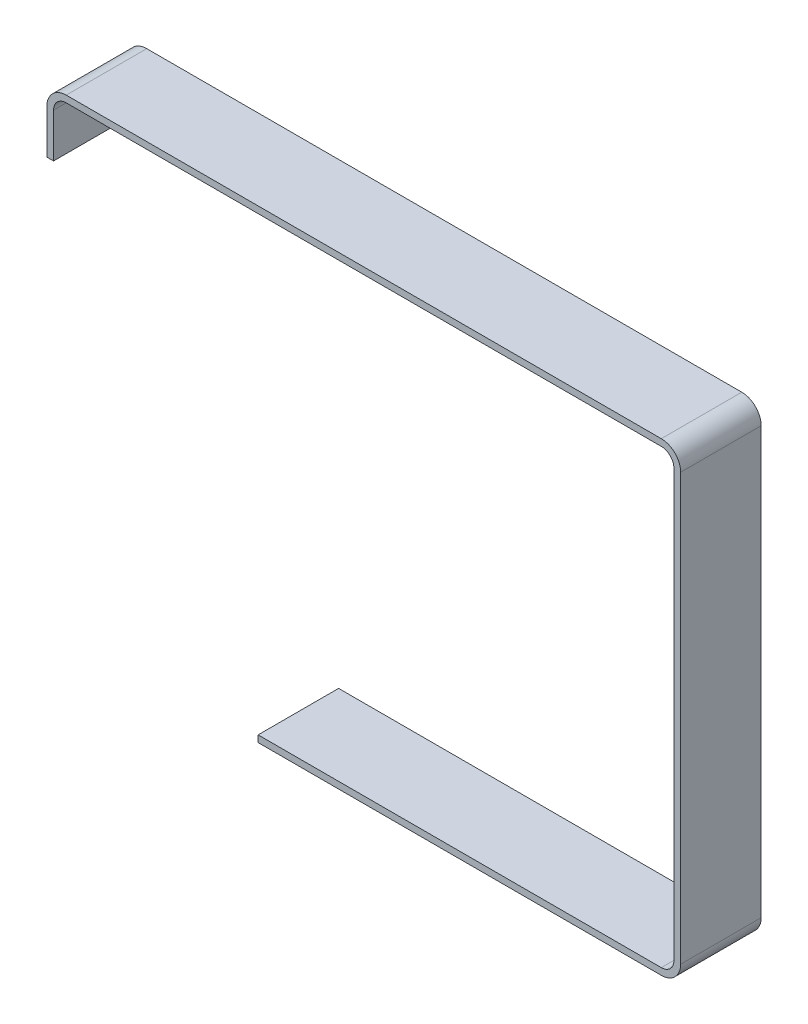
ISO-10303-21;
HEADER;
FILE_DESCRIPTION(('STEP AP214'),'2;1');
FILE_NAME('part.step','',(''),(''),'','','');
FILE_SCHEMA(('AUTOMOTIVE_DESIGN { 1 0 10303 214 1 1 1 1 }'));
ENDSEC;
DATA;
#1=APPLICATION_CONTEXT('core data for automotive mechanical design processes');
#2=APPLICATION_PROTOCOL_DEFINITION('international standard','automotive_design',2000,#1);
#3=PRODUCT_CONTEXT('',#1,'mechanical');
#4=PRODUCT('Part','Part','',(#3));
#5=PRODUCT_RELATED_PRODUCT_CATEGORY('part','',(#4));
#6=PRODUCT_DEFINITION_FORMATION('','',#4);
#7=PRODUCT_DEFINITION_CONTEXT('part definition',#1,'design');
#8=PRODUCT_DEFINITION('design','',#6,#7);
#9=PRODUCT_DEFINITION_SHAPE('','',#8);
#10=(LENGTH_UNIT() NAMED_UNIT(*) SI_UNIT(.MILLI.,.METRE.));
#11=(NAMED_UNIT(*) PLANE_ANGLE_UNIT() SI_UNIT($,.RADIAN.));
#12=(NAMED_UNIT(*) SI_UNIT($,.STERADIAN.) SOLID_ANGLE_UNIT());
#13=UNCERTAINTY_MEASURE_WITH_UNIT(LENGTH_MEASURE(1.E-05),#10,'distance_accuracy_value','');
#14=(GEOMETRIC_REPRESENTATION_CONTEXT(3) GLOBAL_UNCERTAINTY_ASSIGNED_CONTEXT((#13)) GLOBAL_UNIT_ASSIGNED_CONTEXT((#10,
#11,#12)) REPRESENTATION_CONTEXT('',''));
#15=CARTESIAN_POINT('',(0.,0.,0.));
#16=DIRECTION('',(0.,0.,1.));
#17=DIRECTION('',(1.,0.,0.));
#18=AXIS2_PLACEMENT_3D('',#15,#16,#17);
#19=CARTESIAN_POINT('',(-100.,0.,19.05));
#20=DIRECTION('',(1.,0.,0.));
#21=DIRECTION('',(0.,0.,-1.));
#22=AXIS2_PLACEMENT_3D('',#19,#20,#21);
#23=PLANE('',#22);
#24=DIRECTION('',(0.,-1.,0.));
#25=VECTOR('',#24,1.);
#26=CARTESIAN_POINT('',(-100.,0.,0.));
#27=LINE('',#26,#25);
#28=CARTESIAN_POINT('',(-100.,1.5875,0.));
#29=VERTEX_POINT('',#28);
#30=CARTESIAN_POINT('',(-100.,0.,0.));
#31=VERTEX_POINT('',#30);
#32=EDGE_CURVE('E171',#29,#31,#27,.T.);
#33=ORIENTED_EDGE('',*,*,#32,.T.);
#34=DIRECTION('',(0.,0.,-1.));
#35=VECTOR('',#34,1.);
#36=CARTESIAN_POINT('',(-100.,0.,19.05));
#37=LINE('',#36,#35);
#38=CARTESIAN_POINT('',(-100.,0.,19.05));
#39=VERTEX_POINT('',#38);
#40=EDGE_CURVE('E153',#39,#31,#37,.T.);
#41=ORIENTED_EDGE('',*,*,#40,.F.);
#42=DIRECTION('',(0.,-1.,0.));
#43=VECTOR('',#42,1.);
#44=CARTESIAN_POINT('',(-100.,0.,19.05));
#45=LINE('',#44,#43);
#46=CARTESIAN_POINT('',(-100.,1.5875,19.05));
#47=VERTEX_POINT('',#46);
#48=EDGE_CURVE('E159',#47,#39,#45,.T.);
#49=ORIENTED_EDGE('',*,*,#48,.F.);
#50=DIRECTION('',(0.,0.,-1.));
#51=VECTOR('',#50,1.);
#52=CARTESIAN_POINT('',(-100.,1.5875,19.05));
#53=LINE('',#52,#51);
#54=EDGE_CURVE('E256',#47,#29,#53,.T.);
#55=ORIENTED_EDGE('',*,*,#54,.T.);
#56=EDGE_LOOP('',(#33,#41,#49,#55));
#57=FACE_BOUND('',#56,.T.);
#58=ADVANCED_FACE('F33',(#57),#23,.F.);
#59=CARTESIAN_POINT('',(-100.,0.,19.05));
#60=DIRECTION('',(0.,1.,0.));
#61=DIRECTION('',(0.,0.,1.));
#62=AXIS2_PLACEMENT_3D('',#59,#60,#61);
#63=PLANE('',#62);
#64=DIRECTION('',(1.,0.,0.));
#65=VECTOR('',#64,1.);
#66=CARTESIAN_POINT('',(-100.,0.,0.));
#67=LINE('',#66,#65);
#68=CARTESIAN_POINT('',(-4.58749999999999,0.,0.));
#69=VERTEX_POINT('',#68);
#70=EDGE_CURVE('E241',#31,#69,#67,.T.);
#71=ORIENTED_EDGE('',*,*,#70,.T.);
#72=DIRECTION('',(0.,0.,-1.));
#73=VECTOR('',#72,1.);
#74=CARTESIAN_POINT('',(-4.58749999999999,0.,19.05));
#75=LINE('',#74,#73);
#76=CARTESIAN_POINT('',(-4.58749999999999,0.,19.05));
#77=VERTEX_POINT('',#76);
#78=EDGE_CURVE('E156',#69,#77,#75,.F.);
#79=ORIENTED_EDGE('',*,*,#78,.T.);
#80=DIRECTION('',(1.,0.,0.));
#81=VECTOR('',#80,1.);
#82=CARTESIAN_POINT('',(-100.,0.,19.05));
#83=LINE('',#82,#81);
#84=EDGE_CURVE('E148',#39,#77,#83,.T.);
#85=ORIENTED_EDGE('',*,*,#84,.F.);
#86=ORIENTED_EDGE('',*,*,#40,.T.);
#87=EDGE_LOOP('',(#71,#79,#85,#86));
#88=FACE_BOUND('',#87,.T.);
#89=ADVANCED_FACE('F151',(#88),#63,.F.);
#90=CARTESIAN_POINT('',(0.,0.,19.05));
#91=DIRECTION('',(-1.,0.,0.));
#92=DIRECTION('',(0.,0.,1.));
#93=AXIS2_PLACEMENT_3D('',#90,#91,#92);
#94=PLANE('',#93);
#95=DIRECTION('',(0.,1.,0.));
#96=VECTOR('',#95,1.);
#97=CARTESIAN_POINT('',(0.,0.,19.05));
#98=LINE('',#97,#96);
#99=CARTESIAN_POINT('',(0.,4.5875,19.05));
#100=VERTEX_POINT('',#99);
#101=CARTESIAN_POINT('',(0.,105.4125,19.05));
#102=VERTEX_POINT('',#101);
#103=EDGE_CURVE('E158',#100,#102,#98,.T.);
#104=ORIENTED_EDGE('',*,*,#103,.F.);
#105=DIRECTION('',(0.,0.,-1.));
#106=VECTOR('',#105,1.);
#107=CARTESIAN_POINT('',(0.,4.5875,19.05));
#108=LINE('',#107,#106);
#109=CARTESIAN_POINT('',(0.,4.5875,0.));
#110=VERTEX_POINT('',#109);
#111=EDGE_CURVE('E208',#100,#110,#108,.T.);
#112=ORIENTED_EDGE('',*,*,#111,.T.);
#113=DIRECTION('',(0.,1.,0.));
#114=VECTOR('',#113,1.);
#115=CARTESIAN_POINT('',(0.,0.,0.));
#116=LINE('',#115,#114);
#117=CARTESIAN_POINT('',(0.,105.4125,0.));
#118=VERTEX_POINT('',#117);
#119=EDGE_CURVE('E237',#110,#118,#116,.T.);
#120=ORIENTED_EDGE('',*,*,#119,.T.);
#121=DIRECTION('',(0.,0.,-1.));
#122=VECTOR('',#121,1.);
#123=CARTESIAN_POINT('',(0.,105.4125,19.05));
#124=LINE('',#123,#122);
#125=EDGE_CURVE('E206',#118,#102,#124,.F.);
#126=ORIENTED_EDGE('',*,*,#125,.T.);
#127=EDGE_LOOP('',(#104,#112,#120,#126));
#128=FACE_BOUND('',#127,.T.);
#129=ADVANCED_FACE('F296',(#128),#94,.F.);
#130=CARTESIAN_POINT('',(0.,110.,19.05));
#131=DIRECTION('',(0.,-1.,0.));
#132=DIRECTION('',(0.,0.,-1.));
#133=AXIS2_PLACEMENT_3D('',#130,#131,#132);
#134=PLANE('',#133);
#135=DIRECTION('',(-1.,0.,0.));
#136=VECTOR('',#135,1.);
#137=CARTESIAN_POINT('',(0.,110.,19.05));
#138=LINE('',#137,#136);
#139=CARTESIAN_POINT('',(-4.5875,110.,19.05));
#140=VERTEX_POINT('',#139);
#141=CARTESIAN_POINT('',(-145.4125,110.,19.05));
#142=VERTEX_POINT('',#141);
#143=EDGE_CURVE('E228',#140,#142,#138,.T.);
#144=ORIENTED_EDGE('',*,*,#143,.F.);
#145=DIRECTION('',(0.,0.,-1.));
#146=VECTOR('',#145,1.);
#147=CARTESIAN_POINT('',(-4.5875,110.,19.05));
#148=LINE('',#147,#146);
#149=CARTESIAN_POINT('',(-4.5875,110.,0.));
#150=VERTEX_POINT('',#149);
#151=EDGE_CURVE('E41',#140,#150,#148,.T.);
#152=ORIENTED_EDGE('',*,*,#151,.T.);
#153=DIRECTION('',(-1.,0.,0.));
#154=VECTOR('',#153,1.);
#155=CARTESIAN_POINT('',(0.,110.,0.));
#156=LINE('',#155,#154);
#157=CARTESIAN_POINT('',(-145.4125,110.,0.));
#158=VERTEX_POINT('',#157);
#159=EDGE_CURVE('E227',#150,#158,#156,.T.);
#160=ORIENTED_EDGE('',*,*,#159,.T.);
#161=DIRECTION('',(0.,0.,-1.));
#162=VECTOR('',#161,1.);
#163=CARTESIAN_POINT('',(-145.4125,110.,19.05));
#164=LINE('',#163,#162);
#165=EDGE_CURVE('E56',#158,#142,#164,.F.);
#166=ORIENTED_EDGE('',*,*,#165,.T.);
#167=EDGE_LOOP('',(#144,#152,#160,#166));
#168=FACE_BOUND('',#167,.T.);
#169=ADVANCED_FACE('F226',(#168),#134,.F.);
#170=CARTESIAN_POINT('',(-150.,110.,19.05));
#171=DIRECTION('',(1.,0.,0.));
#172=DIRECTION('',(0.,1.,0.));
#173=AXIS2_PLACEMENT_3D('',#170,#171,#172);
#174=PLANE('',#173);
#175=DIRECTION('',(0.,-1.,0.));
#176=VECTOR('',#175,1.);
#177=CARTESIAN_POINT('',(-150.,110.,19.05));
#178=LINE('',#177,#176);
#179=CARTESIAN_POINT('',(-150.,105.4125,19.05));
#180=VERTEX_POINT('',#179);
#181=CARTESIAN_POINT('',(-150.,95.,19.05));
#182=VERTEX_POINT('',#181);
#183=EDGE_CURVE('E299',#180,#182,#178,.T.);
#184=ORIENTED_EDGE('',*,*,#183,.F.);
#185=DIRECTION('',(0.,0.,-1.));
#186=VECTOR('',#185,1.);
#187=CARTESIAN_POINT('',(-150.,105.4125,19.05));
#188=LINE('',#187,#186);
#189=CARTESIAN_POINT('',(-150.,105.4125,0.));
#190=VERTEX_POINT('',#189);
#191=EDGE_CURVE('E11',#180,#190,#188,.T.);
#192=ORIENTED_EDGE('',*,*,#191,.T.);
#193=DIRECTION('',(0.,-1.,0.));
#194=VECTOR('',#193,1.);
#195=CARTESIAN_POINT('',(-150.,110.,0.));
#196=LINE('',#195,#194);
#197=CARTESIAN_POINT('',(-150.,95.,0.));
#198=VERTEX_POINT('',#197);
#199=EDGE_CURVE('E236',#190,#198,#196,.T.);
#200=ORIENTED_EDGE('',*,*,#199,.T.);
#201=DIRECTION('',(0.,0.,-1.));
#202=VECTOR('',#201,1.);
#203=CARTESIAN_POINT('',(-150.,95.,19.05));
#204=LINE('',#203,#202);
#205=EDGE_CURVE('E173',#182,#198,#204,.T.);
#206=ORIENTED_EDGE('',*,*,#205,.F.);
#207=EDGE_LOOP('',(#184,#192,#200,#206));
#208=FACE_BOUND('',#207,.T.);
#209=ADVANCED_FACE('F305',(#208),#174,.F.);
#210=CARTESIAN_POINT('',(-150.,95.,19.05));
#211=DIRECTION('',(0.,1.,0.));
#212=DIRECTION('',(0.,0.,1.));
#213=AXIS2_PLACEMENT_3D('',#210,#211,#212);
#214=PLANE('',#213);
#215=DIRECTION('',(1.,0.,0.));
#216=VECTOR('',#215,1.);
#217=CARTESIAN_POINT('',(-150.,95.,0.));
#218=LINE('',#217,#216);
#219=CARTESIAN_POINT('',(-148.4125,95.,0.));
#220=VERTEX_POINT('',#219);
#221=EDGE_CURVE('E239',#198,#220,#218,.T.);
#222=ORIENTED_EDGE('',*,*,#221,.T.);
#223=DIRECTION('',(0.,0.,-1.));
#224=VECTOR('',#223,1.);
#225=CARTESIAN_POINT('',(-148.4125,95.,19.05));
#226=LINE('',#225,#224);
#227=CARTESIAN_POINT('',(-148.4125,95.,19.05));
#228=VERTEX_POINT('',#227);
#229=EDGE_CURVE('E179',#228,#220,#226,.T.);
#230=ORIENTED_EDGE('',*,*,#229,.F.);
#231=DIRECTION('',(1.,0.,0.));
#232=VECTOR('',#231,1.);
#233=CARTESIAN_POINT('',(-150.,95.,19.05));
#234=LINE('',#233,#232);
#235=EDGE_CURVE('E285',#182,#228,#234,.T.);
#236=ORIENTED_EDGE('',*,*,#235,.F.);
#237=ORIENTED_EDGE('',*,*,#205,.T.);
#238=EDGE_LOOP('',(#222,#230,#236,#237));
#239=FACE_BOUND('',#238,.T.);
#240=ADVANCED_FACE('F303',(#239),#214,.F.);
#241=CARTESIAN_POINT('',(-148.4125,108.4125,19.05));
#242=DIRECTION('',(-1.,0.,0.));
#243=DIRECTION('',(0.,0.,1.));
#244=AXIS2_PLACEMENT_3D('',#241,#242,#243);
#245=PLANE('',#244);
#246=DIRECTION('',(0.,1.,0.));
#247=VECTOR('',#246,1.);
#248=CARTESIAN_POINT('',(-148.4125,108.4125,0.));
#249=LINE('',#248,#247);
#250=CARTESIAN_POINT('',(-148.4125,105.4125,0.));
#251=VERTEX_POINT('',#250);
#252=EDGE_CURVE('E246',#220,#251,#249,.T.);
#253=ORIENTED_EDGE('',*,*,#252,.T.);
#254=DIRECTION('',(0.,0.,-1.));
#255=VECTOR('',#254,1.);
#256=CARTESIAN_POINT('',(-148.4125,105.4125,19.05));
#257=LINE('',#256,#255);
#258=CARTESIAN_POINT('',(-148.4125,105.4125,19.05));
#259=VERTEX_POINT('',#258);
#260=EDGE_CURVE('E192',#251,#259,#257,.F.);
#261=ORIENTED_EDGE('',*,*,#260,.T.);
#262=DIRECTION('',(0.,1.,0.));
#263=VECTOR('',#262,1.);
#264=CARTESIAN_POINT('',(-148.4125,108.4125,19.05));
#265=LINE('',#264,#263);
#266=EDGE_CURVE('E265',#228,#259,#265,.T.);
#267=ORIENTED_EDGE('',*,*,#266,.F.);
#268=ORIENTED_EDGE('',*,*,#229,.T.);
#269=EDGE_LOOP('',(#253,#261,#267,#268));
#270=FACE_BOUND('',#269,.T.);
#271=ADVANCED_FACE('F262',(#270),#245,.F.);
#272=CARTESIAN_POINT('',(-1.5875,108.4125,19.05));
#273=DIRECTION('',(0.,1.,0.));
#274=DIRECTION('',(-1.,0.,0.));
#275=AXIS2_PLACEMENT_3D('',#272,#273,#274);
#276=PLANE('',#275);
#277=DIRECTION('',(1.,0.,0.));
#278=VECTOR('',#277,1.);
#279=CARTESIAN_POINT('',(-1.5875,108.4125,0.));
#280=LINE('',#279,#278);
#281=CARTESIAN_POINT('',(-145.4125,108.4125,0.));
#282=VERTEX_POINT('',#281);
#283=CARTESIAN_POINT('',(-4.5875,108.4125,0.));
#284=VERTEX_POINT('',#283);
#285=EDGE_CURVE('E249',#282,#284,#280,.T.);
#286=ORIENTED_EDGE('',*,*,#285,.T.);
#287=DIRECTION('',(0.,0.,-1.));
#288=VECTOR('',#287,1.);
#289=CARTESIAN_POINT('',(-4.5875,108.4125,19.05));
#290=LINE('',#289,#288);
#291=CARTESIAN_POINT('',(-4.5875,108.4125,19.05));
#292=VERTEX_POINT('',#291);
#293=EDGE_CURVE('E190',#284,#292,#290,.F.);
#294=ORIENTED_EDGE('',*,*,#293,.T.);
#295=DIRECTION('',(1.,0.,0.));
#296=VECTOR('',#295,1.);
#297=CARTESIAN_POINT('',(-1.5875,108.4125,19.05));
#298=LINE('',#297,#296);
#299=CARTESIAN_POINT('',(-145.4125,108.4125,19.05));
#300=VERTEX_POINT('',#299);
#301=EDGE_CURVE('E279',#300,#292,#298,.T.);
#302=ORIENTED_EDGE('',*,*,#301,.F.);
#303=DIRECTION('',(0.,0.,-1.));
#304=VECTOR('',#303,1.);
#305=CARTESIAN_POINT('',(-145.4125,108.4125,0.));
#306=LINE('',#305,#304);
#307=EDGE_CURVE('E187',#300,#282,#306,.T.);
#308=ORIENTED_EDGE('',*,*,#307,.T.);
#309=EDGE_LOOP('',(#286,#294,#302,#308));
#310=FACE_BOUND('',#309,.T.);
#311=ADVANCED_FACE('F276',(#310),#276,.F.);
#312=CARTESIAN_POINT('',(-1.5875,1.5875,19.05));
#313=DIRECTION('',(1.,0.,0.));
#314=DIRECTION('',(0.,0.,-1.));
#315=AXIS2_PLACEMENT_3D('',#312,#313,#314);
#316=PLANE('',#315);
#317=DIRECTION('',(0.,-1.,0.));
#318=VECTOR('',#317,1.);
#319=CARTESIAN_POINT('',(-1.5875,1.5875,0.));
#320=LINE('',#319,#318);
#321=CARTESIAN_POINT('',(-1.5875,105.4125,0.));
#322=VERTEX_POINT('',#321);
#323=CARTESIAN_POINT('',(-1.5875,4.5875,0.));
#324=VERTEX_POINT('',#323);
#325=EDGE_CURVE('E252',#322,#324,#320,.T.);
#326=ORIENTED_EDGE('',*,*,#325,.T.);
#327=DIRECTION('',(0.,0.,-1.));
#328=VECTOR('',#327,1.);
#329=CARTESIAN_POINT('',(-1.5875,4.5875,19.05));
#330=LINE('',#329,#328);
#331=CARTESIAN_POINT('',(-1.5875,4.5875,19.05));
#332=VERTEX_POINT('',#331);
#333=EDGE_CURVE('E185',#324,#332,#330,.F.);
#334=ORIENTED_EDGE('',*,*,#333,.T.);
#335=DIRECTION('',(0.,-1.,0.));
#336=VECTOR('',#335,1.);
#337=CARTESIAN_POINT('',(-1.5875,1.5875,19.05));
#338=LINE('',#337,#336);
#339=CARTESIAN_POINT('',(-1.5875,105.4125,19.05));
#340=VERTEX_POINT('',#339);
#341=EDGE_CURVE('E281',#340,#332,#338,.T.);
#342=ORIENTED_EDGE('',*,*,#341,.F.);
#343=DIRECTION('',(0.,0.,-1.));
#344=VECTOR('',#343,1.);
#345=CARTESIAN_POINT('',(-1.5875,105.4125,0.));
#346=LINE('',#345,#344);
#347=EDGE_CURVE('E176',#340,#322,#346,.T.);
#348=ORIENTED_EDGE('',*,*,#347,.T.);
#349=EDGE_LOOP('',(#326,#334,#342,#348));
#350=FACE_BOUND('',#349,.T.);
#351=ADVANCED_FACE('F387',(#350),#316,.F.);
#352=CARTESIAN_POINT('',(-100.,1.5875,19.05));
#353=DIRECTION('',(0.,-1.,0.));
#354=DIRECTION('',(0.,0.,-1.));
#355=AXIS2_PLACEMENT_3D('',#352,#353,#354);
#356=PLANE('',#355);
#357=DIRECTION('',(-1.,0.,0.));
#358=VECTOR('',#357,1.);
#359=CARTESIAN_POINT('',(-100.,1.5875,19.05));
#360=LINE('',#359,#358);
#361=CARTESIAN_POINT('',(-4.58749999999999,1.5875,19.05));
#362=VERTEX_POINT('',#361);
#363=EDGE_CURVE('E164',#362,#47,#360,.T.);
#364=ORIENTED_EDGE('',*,*,#363,.F.);
#365=DIRECTION('',(0.,0.,-1.));
#366=VECTOR('',#365,1.);
#367=CARTESIAN_POINT('',(-4.58749999999999,1.5875,0.));
#368=LINE('',#367,#366);
#369=CARTESIAN_POINT('',(-4.58749999999999,1.5875,0.));
#370=VERTEX_POINT('',#369);
#371=EDGE_CURVE('E172',#362,#370,#368,.T.);
#372=ORIENTED_EDGE('',*,*,#371,.T.);
#373=DIRECTION('',(-1.,0.,0.));
#374=VECTOR('',#373,1.);
#375=CARTESIAN_POINT('',(-100.,1.5875,0.));
#376=LINE('',#375,#374);
#377=EDGE_CURVE('E168',#370,#29,#376,.T.);
#378=ORIENTED_EDGE('',*,*,#377,.T.);
#379=ORIENTED_EDGE('',*,*,#54,.F.);
#380=EDGE_LOOP('',(#364,#372,#378,#379));
#381=FACE_BOUND('',#380,.T.);
#382=ADVANCED_FACE('F379',(#381),#356,.F.);
#383=CARTESIAN_POINT('',(0.,0.,19.05));
#384=DIRECTION('',(0.,0.,-1.));
#385=DIRECTION('',(-1.,0.,0.));
#386=AXIS2_PLACEMENT_3D('',#383,#384,#385);
#387=PLANE('',#386);
#388=ORIENTED_EDGE('',*,*,#84,.T.);
#389=CARTESIAN_POINT('',(-4.5875,4.5875,19.05));
#390=DIRECTION('',(0.,0.,-1.));
#391=DIRECTION('',(-1.,0.,0.));
#392=AXIS2_PLACEMENT_3D('',#389,#390,#391);
#393=CIRCLE('',#392,4.5875);
#394=EDGE_CURVE('E221',#77,#100,#393,.F.);
#395=ORIENTED_EDGE('',*,*,#394,.T.);
#396=ORIENTED_EDGE('',*,*,#103,.T.);
#397=CARTESIAN_POINT('',(-4.5875,105.4125,19.05));
#398=DIRECTION('',(0.,0.,-1.));
#399=DIRECTION('',(-1.,0.,0.));
#400=AXIS2_PLACEMENT_3D('',#397,#398,#399);
#401=CIRCLE('',#400,4.5875);
#402=EDGE_CURVE('E219',#102,#140,#401,.F.);
#403=ORIENTED_EDGE('',*,*,#402,.T.);
#404=ORIENTED_EDGE('',*,*,#143,.T.);
#405=CARTESIAN_POINT('',(-145.4125,105.4125,19.05));
#406=DIRECTION('',(0.,0.,-1.));
#407=DIRECTION('',(-1.,0.,0.));
#408=AXIS2_PLACEMENT_3D('',#405,#406,#407);
#409=CIRCLE('',#408,4.5875);
#410=EDGE_CURVE('E48',#142,#180,#409,.F.);
#411=ORIENTED_EDGE('',*,*,#410,.T.);
#412=ORIENTED_EDGE('',*,*,#183,.T.);
#413=ORIENTED_EDGE('',*,*,#235,.T.);
#414=ORIENTED_EDGE('',*,*,#266,.T.);
#415=CARTESIAN_POINT('',(-145.4125,105.4125,19.05));
#416=DIRECTION('',(0.,0.,-1.));
#417=DIRECTION('',(-1.,0.,0.));
#418=AXIS2_PLACEMENT_3D('',#415,#416,#417);
#419=CIRCLE('',#418,3.);
#420=EDGE_CURVE('E204',#259,#300,#419,.T.);
#421=ORIENTED_EDGE('',*,*,#420,.T.);
#422=ORIENTED_EDGE('',*,*,#301,.T.);
#423=CARTESIAN_POINT('',(-4.5875,105.4125,19.05));
#424=DIRECTION('',(0.,0.,-1.));
#425=DIRECTION('',(-1.,0.,0.));
#426=AXIS2_PLACEMENT_3D('',#423,#424,#425);
#427=CIRCLE('',#426,3.);
#428=EDGE_CURVE('E200',#292,#340,#427,.T.);
#429=ORIENTED_EDGE('',*,*,#428,.T.);
#430=ORIENTED_EDGE('',*,*,#341,.T.);
#431=CARTESIAN_POINT('',(-4.58749999999999,4.5875,19.05));
#432=DIRECTION('',(0.,0.,-1.));
#433=DIRECTION('',(-1.,0.,0.));
#434=AXIS2_PLACEMENT_3D('',#431,#432,#433);
#435=CIRCLE('',#434,3.);
#436=EDGE_CURVE('E196',#332,#362,#435,.T.);
#437=ORIENTED_EDGE('',*,*,#436,.T.);
#438=ORIENTED_EDGE('',*,*,#363,.T.);
#439=ORIENTED_EDGE('',*,*,#48,.T.);
#440=EDGE_LOOP('',(#388,#395,#396,#403,#404,#411,#412,#413,#414,#421,#422,#429,#430,#437,#438,#439));
#441=FACE_BOUND('',#440,.T.);
#442=ADVANCED_FACE('F162',(#441),#387,.F.);
#443=CARTESIAN_POINT('',(0.,0.,0.));
#444=DIRECTION('',(0.,0.,-1.));
#445=DIRECTION('',(-1.,0.,0.));
#446=AXIS2_PLACEMENT_3D('',#443,#444,#445);
#447=PLANE('',#446);
#448=ORIENTED_EDGE('',*,*,#119,.F.);
#449=CARTESIAN_POINT('',(-4.5875,4.5875,0.));
#450=DIRECTION('',(0.,0.,-1.));
#451=DIRECTION('',(-1.,0.,0.));
#452=AXIS2_PLACEMENT_3D('',#449,#450,#451);
#453=CIRCLE('',#452,4.5875);
#454=EDGE_CURVE('E215',#110,#69,#453,.T.);
#455=ORIENTED_EDGE('',*,*,#454,.T.);
#456=ORIENTED_EDGE('',*,*,#70,.F.);
#457=ORIENTED_EDGE('',*,*,#32,.F.);
#458=ORIENTED_EDGE('',*,*,#377,.F.);
#459=CARTESIAN_POINT('',(-4.58749999999999,4.5875,0.));
#460=DIRECTION('',(0.,0.,-1.));
#461=DIRECTION('',(-1.,0.,0.));
#462=AXIS2_PLACEMENT_3D('',#459,#460,#461);
#463=CIRCLE('',#462,3.);
#464=EDGE_CURVE('E194',#370,#324,#463,.F.);
#465=ORIENTED_EDGE('',*,*,#464,.T.);
#466=ORIENTED_EDGE('',*,*,#325,.F.);
#467=CARTESIAN_POINT('',(-4.5875,105.4125,0.));
#468=DIRECTION('',(0.,0.,-1.));
#469=DIRECTION('',(-1.,0.,0.));
#470=AXIS2_PLACEMENT_3D('',#467,#468,#469);
#471=CIRCLE('',#470,3.);
#472=EDGE_CURVE('E198',#322,#284,#471,.F.);
#473=ORIENTED_EDGE('',*,*,#472,.T.);
#474=ORIENTED_EDGE('',*,*,#285,.F.);
#475=CARTESIAN_POINT('',(-145.4125,105.4125,0.));
#476=DIRECTION('',(0.,0.,-1.));
#477=DIRECTION('',(-1.,0.,0.));
#478=AXIS2_PLACEMENT_3D('',#475,#476,#477);
#479=CIRCLE('',#478,3.);
#480=EDGE_CURVE('E202',#282,#251,#479,.F.);
#481=ORIENTED_EDGE('',*,*,#480,.T.);
#482=ORIENTED_EDGE('',*,*,#252,.F.);
#483=ORIENTED_EDGE('',*,*,#221,.F.);
#484=ORIENTED_EDGE('',*,*,#199,.F.);
#485=CARTESIAN_POINT('',(-145.4125,105.4125,0.));
#486=DIRECTION('',(0.,0.,-1.));
#487=DIRECTION('',(-1.,0.,0.));
#488=AXIS2_PLACEMENT_3D('',#485,#486,#487);
#489=CIRCLE('',#488,4.5875);
#490=EDGE_CURVE('E211',#190,#158,#489,.T.);
#491=ORIENTED_EDGE('',*,*,#490,.T.);
#492=ORIENTED_EDGE('',*,*,#159,.F.);
#493=CARTESIAN_POINT('',(-4.5875,105.4125,0.));
#494=DIRECTION('',(0.,0.,-1.));
#495=DIRECTION('',(-1.,0.,0.));
#496=AXIS2_PLACEMENT_3D('',#493,#494,#495);
#497=CIRCLE('',#496,4.5875);
#498=EDGE_CURVE('E213',#150,#118,#497,.T.);
#499=ORIENTED_EDGE('',*,*,#498,.T.);
#500=EDGE_LOOP('',(#448,#455,#456,#457,#458,#465,#466,#473,#474,#481,#482,#483,#484,#491,#492,#499));
#501=FACE_BOUND('',#500,.T.);
#502=ADVANCED_FACE('F233',(#501),#447,.T.);
#503=CARTESIAN_POINT('',(-4.58749999999999,4.5875,19.05));
#504=DIRECTION('',(0.,0.,1.));
#505=DIRECTION('',(1.,0.,0.));
#506=AXIS2_PLACEMENT_3D('',#503,#504,#505);
#507=CYLINDRICAL_SURFACE('',#506,3.);
#508=ORIENTED_EDGE('',*,*,#436,.F.);
#509=ORIENTED_EDGE('',*,*,#333,.F.);
#510=ORIENTED_EDGE('',*,*,#464,.F.);
#511=ORIENTED_EDGE('',*,*,#371,.F.);
#512=EDGE_LOOP('',(#508,#509,#510,#511));
#513=FACE_BOUND('',#512,.T.);
#514=ADVANCED_FACE('F321',(#513),#507,.F.);
#515=CARTESIAN_POINT('',(-4.5875,105.4125,19.05));
#516=DIRECTION('',(0.,0.,1.));
#517=DIRECTION('',(1.,0.,0.));
#518=AXIS2_PLACEMENT_3D('',#515,#516,#517);
#519=CYLINDRICAL_SURFACE('',#518,3.);
#520=ORIENTED_EDGE('',*,*,#428,.F.);
#521=ORIENTED_EDGE('',*,*,#293,.F.);
#522=ORIENTED_EDGE('',*,*,#472,.F.);
#523=ORIENTED_EDGE('',*,*,#347,.F.);
#524=EDGE_LOOP('',(#520,#521,#522,#523));
#525=FACE_BOUND('',#524,.T.);
#526=ADVANCED_FACE('F324',(#525),#519,.F.);
#527=CARTESIAN_POINT('',(-145.4125,105.4125,19.05));
#528=DIRECTION('',(0.,0.,1.));
#529=DIRECTION('',(1.,0.,0.));
#530=AXIS2_PLACEMENT_3D('',#527,#528,#529);
#531=CYLINDRICAL_SURFACE('',#530,3.);
#532=ORIENTED_EDGE('',*,*,#420,.F.);
#533=ORIENTED_EDGE('',*,*,#260,.F.);
#534=ORIENTED_EDGE('',*,*,#480,.F.);
#535=ORIENTED_EDGE('',*,*,#307,.F.);
#536=EDGE_LOOP('',(#532,#533,#534,#535));
#537=FACE_BOUND('',#536,.T.);
#538=ADVANCED_FACE('F273',(#537),#531,.F.);
#539=CARTESIAN_POINT('',(-4.5875,4.5875,19.05));
#540=DIRECTION('',(0.,0.,-1.));
#541=DIRECTION('',(-1.,0.,0.));
#542=AXIS2_PLACEMENT_3D('',#539,#540,#541);
#543=CYLINDRICAL_SURFACE('',#542,4.5875);
#544=ORIENTED_EDGE('',*,*,#394,.F.);
#545=ORIENTED_EDGE('',*,*,#78,.F.);
#546=ORIENTED_EDGE('',*,*,#454,.F.);
#547=ORIENTED_EDGE('',*,*,#111,.F.);
#548=EDGE_LOOP('',(#544,#545,#546,#547));
#549=FACE_BOUND('',#548,.T.);
#550=ADVANCED_FACE('F291',(#549),#543,.T.);
#551=CARTESIAN_POINT('',(-4.5875,105.4125,19.05));
#552=DIRECTION('',(0.,0.,-1.));
#553=DIRECTION('',(-1.,0.,0.));
#554=AXIS2_PLACEMENT_3D('',#551,#552,#553);
#555=CYLINDRICAL_SURFACE('',#554,4.5875);
#556=ORIENTED_EDGE('',*,*,#402,.F.);
#557=ORIENTED_EDGE('',*,*,#125,.F.);
#558=ORIENTED_EDGE('',*,*,#498,.F.);
#559=ORIENTED_EDGE('',*,*,#151,.F.);
#560=EDGE_LOOP('',(#556,#557,#558,#559));
#561=FACE_BOUND('',#560,.T.);
#562=ADVANCED_FACE('F309',(#561),#555,.T.);
#563=CARTESIAN_POINT('',(-145.4125,105.4125,19.05));
#564=DIRECTION('',(0.,0.,-1.));
#565=DIRECTION('',(-1.,0.,0.));
#566=AXIS2_PLACEMENT_3D('',#563,#564,#565);
#567=CYLINDRICAL_SURFACE('',#566,4.5875);
#568=ORIENTED_EDGE('',*,*,#410,.F.);
#569=ORIENTED_EDGE('',*,*,#165,.F.);
#570=ORIENTED_EDGE('',*,*,#490,.F.);
#571=ORIENTED_EDGE('',*,*,#191,.F.);
#572=EDGE_LOOP('',(#568,#569,#570,#571));
#573=FACE_BOUND('',#572,.T.);
#574=ADVANCED_FACE('F35',(#573),#567,.T.);
#575=CLOSED_SHELL('',(#58,#89,#129,#169,#209,#240,#271,#311,#351,#382,#442,#502,#514,#526,#538,
#550,#562,#574));
#576=MANIFOLD_SOLID_BREP('B2',#575);
#577=ADVANCED_BREP_SHAPE_REPRESENTATION('',(#18,#576),#14);
#578=SHAPE_DEFINITION_REPRESENTATION(#9,#577);
ENDSEC;
END-ISO-10303-21;
